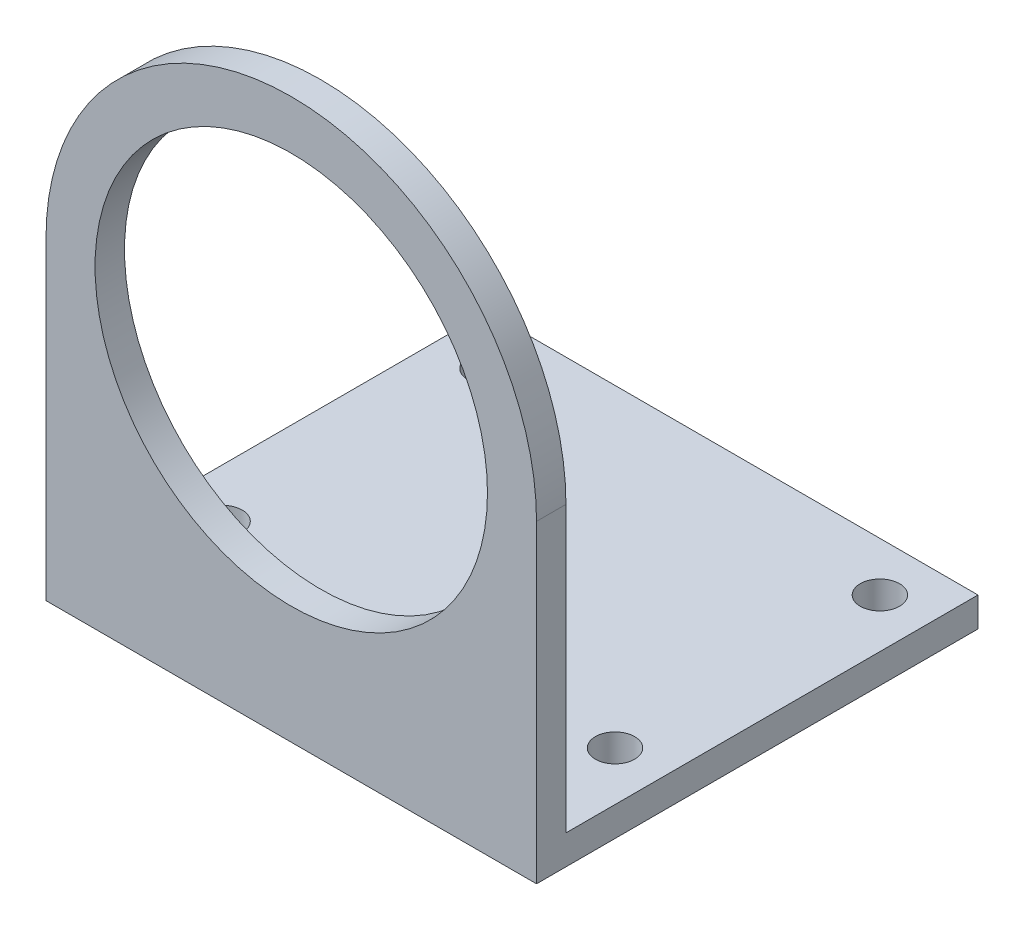
ISO-10303-21;
HEADER;
FILE_DESCRIPTION(('STEP AP214'),'2;1');
FILE_NAME('part.step','',(''),(''),'','','');
FILE_SCHEMA(('AUTOMOTIVE_DESIGN { 1 0 10303 214 1 1 1 1 }'));
ENDSEC;
DATA;
#1=APPLICATION_CONTEXT('core data for automotive mechanical design processes');
#2=APPLICATION_PROTOCOL_DEFINITION('international standard','automotive_design',2000,#1);
#3=PRODUCT_CONTEXT('',#1,'mechanical');
#4=PRODUCT('Part','Part','',(#3));
#5=PRODUCT_RELATED_PRODUCT_CATEGORY('part','',(#4));
#6=PRODUCT_DEFINITION_FORMATION('','',#4);
#7=PRODUCT_DEFINITION_CONTEXT('part definition',#1,'design');
#8=PRODUCT_DEFINITION('design','',#6,#7);
#9=PRODUCT_DEFINITION_SHAPE('','',#8);
#10=(LENGTH_UNIT() NAMED_UNIT(*) SI_UNIT(.MILLI.,.METRE.));
#11=(NAMED_UNIT(*) PLANE_ANGLE_UNIT() SI_UNIT($,.RADIAN.));
#12=(NAMED_UNIT(*) SI_UNIT($,.STERADIAN.) SOLID_ANGLE_UNIT());
#13=UNCERTAINTY_MEASURE_WITH_UNIT(LENGTH_MEASURE(1.E-05),#10,'distance_accuracy_value','');
#14=(GEOMETRIC_REPRESENTATION_CONTEXT(3) GLOBAL_UNCERTAINTY_ASSIGNED_CONTEXT((#13)) GLOBAL_UNIT_ASSIGNED_CONTEXT((#10,
#11,#12)) REPRESENTATION_CONTEXT('',''));
#15=CARTESIAN_POINT('',(0.,0.,0.));
#16=DIRECTION('',(0.,0.,1.));
#17=DIRECTION('',(1.,0.,0.));
#18=AXIS2_PLACEMENT_3D('',#15,#16,#17);
#19=CARTESIAN_POINT('',(0.,29.,3.));
#20=DIRECTION('',(0.,0.,-1.));
#21=DIRECTION('',(-1.,0.,0.));
#22=AXIS2_PLACEMENT_3D('',#19,#20,#21);
#23=PLANE('',#22);
#24=DIRECTION('',(0.,1.,0.));
#25=VECTOR('',#24,1.);
#26=CARTESIAN_POINT('',(25.,29.,3.));
#27=LINE('',#26,#25);
#28=CARTESIAN_POINT('',(25.,-3.,3.));
#29=VERTEX_POINT('',#28);
#30=CARTESIAN_POINT('',(25.,29.,3.));
#31=VERTEX_POINT('',#30);
#32=EDGE_CURVE('E105',#29,#31,#27,.T.);
#33=ORIENTED_EDGE('',*,*,#32,.T.);
#34=CARTESIAN_POINT('',(0.,29.,3.));
#35=DIRECTION('',(0.,0.,1.));
#36=DIRECTION('',(-1.,0.,0.));
#37=AXIS2_PLACEMENT_3D('',#34,#35,#36);
#38=CIRCLE('',#37,25.);
#39=CARTESIAN_POINT('',(-25.,29.,3.));
#40=VERTEX_POINT('',#39);
#41=EDGE_CURVE('E65',#31,#40,#38,.T.);
#42=ORIENTED_EDGE('',*,*,#41,.T.);
#43=DIRECTION('',(0.,-1.,0.));
#44=VECTOR('',#43,1.);
#45=CARTESIAN_POINT('',(-25.,0.,3.));
#46=LINE('',#45,#44);
#47=CARTESIAN_POINT('',(-25.,-3.,3.));
#48=VERTEX_POINT('',#47);
#49=EDGE_CURVE('E138',#40,#48,#46,.T.);
#50=ORIENTED_EDGE('',*,*,#49,.T.);
#51=DIRECTION('',(1.,0.,0.));
#52=VECTOR('',#51,1.);
#53=CARTESIAN_POINT('',(-25.,-3.,3.));
#54=LINE('',#53,#52);
#55=EDGE_CURVE('E163',#48,#29,#54,.T.);
#56=ORIENTED_EDGE('',*,*,#55,.T.);
#57=EDGE_LOOP('',(#33,#42,#50,#56));
#58=FACE_BOUND('',#57,.T.);
#59=CARTESIAN_POINT('',(0.,29.,3.));
#60=DIRECTION('',(0.,0.,1.));
#61=DIRECTION('',(1.,0.,0.));
#62=AXIS2_PLACEMENT_3D('',#59,#60,#61);
#63=CIRCLE('',#62,20.);
#64=CARTESIAN_POINT('',(20.,29.,3.));
#65=VERTEX_POINT('',#64);
#66=EDGE_CURVE('E125',#65,#65,#63,.T.);
#67=ORIENTED_EDGE('',*,*,#66,.F.);
#68=EDGE_LOOP('',(#67));
#69=FACE_BOUND('',#68,.T.);
#70=ADVANCED_FACE('F47',(#58,#69),#23,.F.);
#71=CARTESIAN_POINT('',(0.,29.,0.));
#72=DIRECTION('',(0.,0.,-1.));
#73=DIRECTION('',(-1.,0.,0.));
#74=AXIS2_PLACEMENT_3D('',#71,#72,#73);
#75=PLANE('',#74);
#76=DIRECTION('',(0.,1.,0.));
#77=VECTOR('',#76,1.);
#78=CARTESIAN_POINT('',(25.,29.,0.));
#79=LINE('',#78,#77);
#80=CARTESIAN_POINT('',(25.,0.,0.));
#81=VERTEX_POINT('',#80);
#82=CARTESIAN_POINT('',(25.,29.,0.));
#83=VERTEX_POINT('',#82);
#84=EDGE_CURVE('E100',#81,#83,#79,.T.);
#85=ORIENTED_EDGE('',*,*,#84,.F.);
#86=DIRECTION('',(1.,0.,0.));
#87=VECTOR('',#86,1.);
#88=CARTESIAN_POINT('',(-25.,0.,0.));
#89=LINE('',#88,#87);
#90=CARTESIAN_POINT('',(-25.,0.,0.));
#91=VERTEX_POINT('',#90);
#92=EDGE_CURVE('E93',#91,#81,#89,.T.);
#93=ORIENTED_EDGE('',*,*,#92,.F.);
#94=DIRECTION('',(0.,-1.,0.));
#95=VECTOR('',#94,1.);
#96=CARTESIAN_POINT('',(-25.,0.,0.));
#97=LINE('',#96,#95);
#98=CARTESIAN_POINT('',(-25.,29.,0.));
#99=VERTEX_POINT('',#98);
#100=EDGE_CURVE('E82',#99,#91,#97,.T.);
#101=ORIENTED_EDGE('',*,*,#100,.F.);
#102=CARTESIAN_POINT('',(0.,29.,0.));
#103=DIRECTION('',(0.,0.,1.));
#104=DIRECTION('',(-1.,0.,0.));
#105=AXIS2_PLACEMENT_3D('',#102,#103,#104);
#106=CIRCLE('',#105,25.);
#107=EDGE_CURVE('E76',#83,#99,#106,.T.);
#108=ORIENTED_EDGE('',*,*,#107,.F.);
#109=EDGE_LOOP('',(#85,#93,#101,#108));
#110=FACE_BOUND('',#109,.T.);
#111=CARTESIAN_POINT('',(0.,29.,0.));
#112=DIRECTION('',(0.,0.,1.));
#113=DIRECTION('',(1.,0.,0.));
#114=AXIS2_PLACEMENT_3D('',#111,#112,#113);
#115=CIRCLE('',#114,20.);
#116=CARTESIAN_POINT('',(20.,29.,0.));
#117=VERTEX_POINT('',#116);
#118=EDGE_CURVE('E129',#117,#117,#115,.T.);
#119=ORIENTED_EDGE('',*,*,#118,.T.);
#120=EDGE_LOOP('',(#119));
#121=FACE_BOUND('',#120,.T.);
#122=ADVANCED_FACE('F97',(#110,#121),#75,.T.);
#123=CARTESIAN_POINT('',(25.,29.,3.));
#124=DIRECTION('',(-1.,0.,0.));
#125=DIRECTION('',(0.,-1.,0.));
#126=AXIS2_PLACEMENT_3D('',#123,#124,#125);
#127=PLANE('',#126);
#128=ORIENTED_EDGE('',*,*,#84,.T.);
#129=DIRECTION('',(0.,0.,-1.));
#130=VECTOR('',#129,1.);
#131=CARTESIAN_POINT('',(25.,29.,3.));
#132=LINE('',#131,#130);
#133=EDGE_CURVE('E11',#31,#83,#132,.T.);
#134=ORIENTED_EDGE('',*,*,#133,.F.);
#135=ORIENTED_EDGE('',*,*,#32,.F.);
#136=DIRECTION('',(0.,0.,1.));
#137=VECTOR('',#136,1.);
#138=CARTESIAN_POINT('',(25.,-3.,-42.));
#139=LINE('',#138,#137);
#140=CARTESIAN_POINT('',(25.,-3.,-42.));
#141=VERTEX_POINT('',#140);
#142=EDGE_CURVE('E118',#141,#29,#139,.T.);
#143=ORIENTED_EDGE('',*,*,#142,.F.);
#144=DIRECTION('',(0.,1.,0.));
#145=VECTOR('',#144,1.);
#146=CARTESIAN_POINT('',(25.,-3.,-42.));
#147=LINE('',#146,#145);
#148=CARTESIAN_POINT('',(25.,0.,-42.));
#149=VERTEX_POINT('',#148);
#150=EDGE_CURVE('E113',#141,#149,#147,.T.);
#151=ORIENTED_EDGE('',*,*,#150,.T.);
#152=DIRECTION('',(0.,0.,1.));
#153=VECTOR('',#152,1.);
#154=CARTESIAN_POINT('',(25.,0.,-42.));
#155=LINE('',#154,#153);
#156=EDGE_CURVE('E133',#149,#81,#155,.T.);
#157=ORIENTED_EDGE('',*,*,#156,.T.);
#158=EDGE_LOOP('',(#128,#134,#135,#143,#151,#157));
#159=FACE_BOUND('',#158,.T.);
#160=ADVANCED_FACE('F49',(#159),#127,.F.);
#161=CARTESIAN_POINT('',(0.,29.,3.));
#162=DIRECTION('',(0.,0.,-1.));
#163=DIRECTION('',(-1.,0.,0.));
#164=AXIS2_PLACEMENT_3D('',#161,#162,#163);
#165=CYLINDRICAL_SURFACE('',#164,25.);
#166=ORIENTED_EDGE('',*,*,#107,.T.);
#167=DIRECTION('',(0.,0.,-1.));
#168=VECTOR('',#167,1.);
#169=CARTESIAN_POINT('',(-25.,29.,3.));
#170=LINE('',#169,#168);
#171=EDGE_CURVE('E57',#40,#99,#170,.T.);
#172=ORIENTED_EDGE('',*,*,#171,.F.);
#173=ORIENTED_EDGE('',*,*,#41,.F.);
#174=ORIENTED_EDGE('',*,*,#133,.T.);
#175=EDGE_LOOP('',(#166,#172,#173,#174));
#176=FACE_BOUND('',#175,.T.);
#177=ADVANCED_FACE('F243',(#176),#165,.T.);
#178=CARTESIAN_POINT('',(-25.,0.,3.));
#179=DIRECTION('',(1.,0.,0.));
#180=DIRECTION('',(0.,1.,0.));
#181=AXIS2_PLACEMENT_3D('',#178,#179,#180);
#182=PLANE('',#181);
#183=ORIENTED_EDGE('',*,*,#100,.T.);
#184=DIRECTION('',(0.,0.,1.));
#185=VECTOR('',#184,1.);
#186=CARTESIAN_POINT('',(-25.,0.,-42.));
#187=LINE('',#186,#185);
#188=CARTESIAN_POINT('',(-25.,0.,-42.));
#189=VERTEX_POINT('',#188);
#190=EDGE_CURVE('E88',#189,#91,#187,.T.);
#191=ORIENTED_EDGE('',*,*,#190,.F.);
#192=DIRECTION('',(0.,-1.,0.));
#193=VECTOR('',#192,1.);
#194=CARTESIAN_POINT('',(-25.,0.,-42.));
#195=LINE('',#194,#193);
#196=CARTESIAN_POINT('',(-25.,-3.,-42.));
#197=VERTEX_POINT('',#196);
#198=EDGE_CURVE('E169',#189,#197,#195,.T.);
#199=ORIENTED_EDGE('',*,*,#198,.T.);
#200=DIRECTION('',(0.,0.,1.));
#201=VECTOR('',#200,1.);
#202=CARTESIAN_POINT('',(-25.,-3.,-42.));
#203=LINE('',#202,#201);
#204=EDGE_CURVE('E112',#197,#48,#203,.T.);
#205=ORIENTED_EDGE('',*,*,#204,.T.);
#206=ORIENTED_EDGE('',*,*,#49,.F.);
#207=ORIENTED_EDGE('',*,*,#171,.T.);
#208=EDGE_LOOP('',(#183,#191,#199,#205,#206,#207));
#209=FACE_BOUND('',#208,.T.);
#210=ADVANCED_FACE('F84',(#209),#182,.F.);
#211=CARTESIAN_POINT('',(0.,29.,3.));
#212=DIRECTION('',(0.,0.,-1.));
#213=DIRECTION('',(-1.,0.,0.));
#214=AXIS2_PLACEMENT_3D('',#211,#212,#213);
#215=CYLINDRICAL_SURFACE('',#214,20.);
#216=ORIENTED_EDGE('',*,*,#66,.T.);
#217=EDGE_LOOP('',(#216));
#218=FACE_BOUND('',#217,.T.);
#219=ORIENTED_EDGE('',*,*,#118,.F.);
#220=EDGE_LOOP('',(#219));
#221=FACE_BOUND('',#220,.T.);
#222=ADVANCED_FACE('F210',(#218,#221),#215,.F.);
#223=CARTESIAN_POINT('',(25.,0.,-42.));
#224=DIRECTION('',(0.,1.,0.));
#225=DIRECTION('',(-1.,0.,0.));
#226=AXIS2_PLACEMENT_3D('',#223,#224,#225);
#227=PLANE('',#226);
#228=CARTESIAN_POINT('',(20.,0.,-37.));
#229=DIRECTION('',(0.,1.,0.));
#230=DIRECTION('',(1.,0.,0.));
#231=AXIS2_PLACEMENT_3D('',#228,#229,#230);
#232=CIRCLE('',#231,2.);
#233=CARTESIAN_POINT('',(22.,0.,-37.));
#234=VERTEX_POINT('',#233);
#235=EDGE_CURVE('E186',#234,#234,#232,.T.);
#236=ORIENTED_EDGE('',*,*,#235,.F.);
#237=EDGE_LOOP('',(#236));
#238=FACE_BOUND('',#237,.T.);
#239=CARTESIAN_POINT('',(20.,0.,-10.));
#240=DIRECTION('',(0.,1.,0.));
#241=DIRECTION('',(1.,0.,0.));
#242=AXIS2_PLACEMENT_3D('',#239,#240,#241);
#243=CIRCLE('',#242,2.);
#244=CARTESIAN_POINT('',(22.,0.,-10.));
#245=VERTEX_POINT('',#244);
#246=EDGE_CURVE('E193',#245,#245,#243,.T.);
#247=ORIENTED_EDGE('',*,*,#246,.F.);
#248=EDGE_LOOP('',(#247));
#249=FACE_BOUND('',#248,.T.);
#250=CARTESIAN_POINT('',(-20.,0.,-10.));
#251=DIRECTION('',(0.,1.,0.));
#252=DIRECTION('',(-1.,0.,0.));
#253=AXIS2_PLACEMENT_3D('',#250,#251,#252);
#254=CIRCLE('',#253,2.);
#255=CARTESIAN_POINT('',(-22.,0.,-10.));
#256=VERTEX_POINT('',#255);
#257=EDGE_CURVE('E178',#256,#256,#254,.T.);
#258=ORIENTED_EDGE('',*,*,#257,.F.);
#259=EDGE_LOOP('',(#258));
#260=FACE_BOUND('',#259,.T.);
#261=CARTESIAN_POINT('',(-20.,0.,-37.));
#262=DIRECTION('',(0.,1.,0.));
#263=DIRECTION('',(-1.,0.,0.));
#264=AXIS2_PLACEMENT_3D('',#261,#262,#263);
#265=CIRCLE('',#264,2.);
#266=CARTESIAN_POINT('',(-22.,0.,-37.));
#267=VERTEX_POINT('',#266);
#268=EDGE_CURVE('E174',#267,#267,#265,.T.);
#269=ORIENTED_EDGE('',*,*,#268,.F.);
#270=EDGE_LOOP('',(#269));
#271=FACE_BOUND('',#270,.T.);
#272=ORIENTED_EDGE('',*,*,#190,.T.);
#273=ORIENTED_EDGE('',*,*,#92,.T.);
#274=ORIENTED_EDGE('',*,*,#156,.F.);
#275=DIRECTION('',(-1.,0.,0.));
#276=VECTOR('',#275,1.);
#277=CARTESIAN_POINT('',(25.,0.,-42.));
#278=LINE('',#277,#276);
#279=EDGE_CURVE('E110',#149,#189,#278,.T.);
#280=ORIENTED_EDGE('',*,*,#279,.T.);
#281=EDGE_LOOP('',(#272,#273,#274,#280));
#282=FACE_BOUND('',#281,.T.);
#283=ADVANCED_FACE('F108',(#238,#249,#260,#271,#282),#227,.T.);
#284=CARTESIAN_POINT('',(-25.,-3.,-42.));
#285=DIRECTION('',(0.,-1.,0.));
#286=DIRECTION('',(0.,0.,-1.));
#287=AXIS2_PLACEMENT_3D('',#284,#285,#286);
#288=PLANE('',#287);
#289=CARTESIAN_POINT('',(20.,-3.,-37.));
#290=DIRECTION('',(0.,1.,0.));
#291=DIRECTION('',(1.,0.,0.));
#292=AXIS2_PLACEMENT_3D('',#289,#290,#291);
#293=CIRCLE('',#292,2.);
#294=CARTESIAN_POINT('',(22.,-3.,-37.));
#295=VERTEX_POINT('',#294);
#296=EDGE_CURVE('E182',#295,#295,#293,.T.);
#297=ORIENTED_EDGE('',*,*,#296,.T.);
#298=EDGE_LOOP('',(#297));
#299=FACE_BOUND('',#298,.T.);
#300=CARTESIAN_POINT('',(20.,-3.,-10.));
#301=DIRECTION('',(0.,1.,0.));
#302=DIRECTION('',(1.,0.,0.));
#303=AXIS2_PLACEMENT_3D('',#300,#301,#302);
#304=CIRCLE('',#303,2.);
#305=CARTESIAN_POINT('',(22.,-3.,-10.));
#306=VERTEX_POINT('',#305);
#307=EDGE_CURVE('E190',#306,#306,#304,.T.);
#308=ORIENTED_EDGE('',*,*,#307,.T.);
#309=EDGE_LOOP('',(#308));
#310=FACE_BOUND('',#309,.T.);
#311=CARTESIAN_POINT('',(-20.,-3.00000000000001,-10.));
#312=DIRECTION('',(0.,1.,0.));
#313=DIRECTION('',(-1.,0.,0.));
#314=AXIS2_PLACEMENT_3D('',#311,#312,#313);
#315=CIRCLE('',#314,2.);
#316=CARTESIAN_POINT('',(-22.,-3.00000000000001,-10.));
#317=VERTEX_POINT('',#316);
#318=EDGE_CURVE('E197',#317,#317,#315,.T.);
#319=ORIENTED_EDGE('',*,*,#318,.T.);
#320=EDGE_LOOP('',(#319));
#321=FACE_BOUND('',#320,.T.);
#322=CARTESIAN_POINT('',(-20.,-3.00000000000001,-37.));
#323=DIRECTION('',(0.,1.,0.));
#324=DIRECTION('',(-1.,0.,0.));
#325=AXIS2_PLACEMENT_3D('',#322,#323,#324);
#326=CIRCLE('',#325,2.);
#327=CARTESIAN_POINT('',(-22.,-3.00000000000001,-37.));
#328=VERTEX_POINT('',#327);
#329=EDGE_CURVE('E165',#328,#328,#326,.T.);
#330=ORIENTED_EDGE('',*,*,#329,.T.);
#331=EDGE_LOOP('',(#330));
#332=FACE_BOUND('',#331,.T.);
#333=ORIENTED_EDGE('',*,*,#55,.F.);
#334=ORIENTED_EDGE('',*,*,#204,.F.);
#335=DIRECTION('',(1.,0.,0.));
#336=VECTOR('',#335,1.);
#337=CARTESIAN_POINT('',(-25.,-3.,-42.));
#338=LINE('',#337,#336);
#339=EDGE_CURVE('E121',#197,#141,#338,.T.);
#340=ORIENTED_EDGE('',*,*,#339,.T.);
#341=ORIENTED_EDGE('',*,*,#142,.T.);
#342=EDGE_LOOP('',(#333,#334,#340,#341));
#343=FACE_BOUND('',#342,.T.);
#344=ADVANCED_FACE('F209',(#299,#310,#321,#332,#343),#288,.T.);
#345=CARTESIAN_POINT('',(0.,0.,-42.));
#346=DIRECTION('',(0.,0.,1.));
#347=DIRECTION('',(1.,0.,0.));
#348=AXIS2_PLACEMENT_3D('',#345,#346,#347);
#349=PLANE('',#348);
#350=ORIENTED_EDGE('',*,*,#279,.F.);
#351=ORIENTED_EDGE('',*,*,#150,.F.);
#352=ORIENTED_EDGE('',*,*,#339,.F.);
#353=ORIENTED_EDGE('',*,*,#198,.F.);
#354=EDGE_LOOP('',(#350,#351,#352,#353));
#355=FACE_BOUND('',#354,.T.);
#356=ADVANCED_FACE('F217',(#355),#349,.F.);
#357=CARTESIAN_POINT('',(-20.,-3.00000000000001,-37.));
#358=DIRECTION('',(0.,1.,0.));
#359=DIRECTION('',(-1.,0.,0.));
#360=AXIS2_PLACEMENT_3D('',#357,#358,#359);
#361=CYLINDRICAL_SURFACE('',#360,2.);
#362=ORIENTED_EDGE('',*,*,#329,.F.);
#363=EDGE_LOOP('',(#362));
#364=FACE_BOUND('',#363,.T.);
#365=ORIENTED_EDGE('',*,*,#268,.T.);
#366=EDGE_LOOP('',(#365));
#367=FACE_BOUND('',#366,.T.);
#368=ADVANCED_FACE('F215',(#364,#367),#361,.F.);
#369=CARTESIAN_POINT('',(-20.,-3.00000000000001,-10.));
#370=DIRECTION('',(0.,1.,0.));
#371=DIRECTION('',(-1.,0.,0.));
#372=AXIS2_PLACEMENT_3D('',#369,#370,#371);
#373=CYLINDRICAL_SURFACE('',#372,2.);
#374=ORIENTED_EDGE('',*,*,#318,.F.);
#375=EDGE_LOOP('',(#374));
#376=FACE_BOUND('',#375,.T.);
#377=ORIENTED_EDGE('',*,*,#257,.T.);
#378=EDGE_LOOP('',(#377));
#379=FACE_BOUND('',#378,.T.);
#380=ADVANCED_FACE('F205',(#376,#379),#373,.F.);
#381=CARTESIAN_POINT('',(20.,-3.,-10.));
#382=DIRECTION('',(0.,1.,0.));
#383=DIRECTION('',(-1.,0.,0.));
#384=AXIS2_PLACEMENT_3D('',#381,#382,#383);
#385=CYLINDRICAL_SURFACE('',#384,2.);
#386=ORIENTED_EDGE('',*,*,#307,.F.);
#387=EDGE_LOOP('',(#386));
#388=FACE_BOUND('',#387,.T.);
#389=ORIENTED_EDGE('',*,*,#246,.T.);
#390=EDGE_LOOP('',(#389));
#391=FACE_BOUND('',#390,.T.);
#392=ADVANCED_FACE('F224',(#388,#391),#385,.F.);
#393=CARTESIAN_POINT('',(20.,-3.,-37.));
#394=DIRECTION('',(0.,1.,0.));
#395=DIRECTION('',(-1.,0.,0.));
#396=AXIS2_PLACEMENT_3D('',#393,#394,#395);
#397=CYLINDRICAL_SURFACE('',#396,2.);
#398=ORIENTED_EDGE('',*,*,#296,.F.);
#399=EDGE_LOOP('',(#398));
#400=FACE_BOUND('',#399,.T.);
#401=ORIENTED_EDGE('',*,*,#235,.T.);
#402=EDGE_LOOP('',(#401));
#403=FACE_BOUND('',#402,.T.);
#404=ADVANCED_FACE('F278',(#400,#403),#397,.F.);
#405=CLOSED_SHELL('',(#70,#122,#160,#177,#210,#222,#283,#344,#356,#368,#380,#392,#404));
#406=MANIFOLD_SOLID_BREP('B2',#405);
#407=ADVANCED_BREP_SHAPE_REPRESENTATION('',(#18,#406),#14);
#408=SHAPE_DEFINITION_REPRESENTATION(#9,#407);
ENDSEC;
END-ISO-10303-21;
